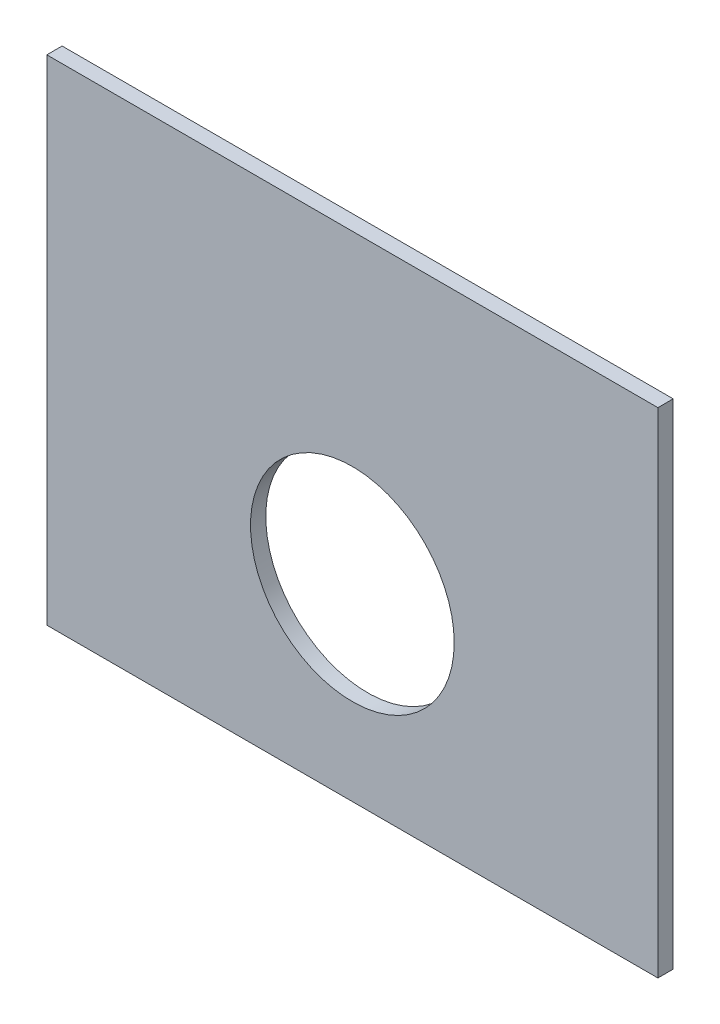
ISO-10303-21;
HEADER;
FILE_DESCRIPTION(('STEP AP214'),'2;1');
FILE_NAME('part.step','',(''),(''),'','','');
FILE_SCHEMA(('AUTOMOTIVE_DESIGN { 1 0 10303 214 1 1 1 1 }'));
ENDSEC;
DATA;
#1=APPLICATION_CONTEXT('core data for automotive mechanical design processes');
#2=APPLICATION_PROTOCOL_DEFINITION('international standard','automotive_design',2000,#1);
#3=PRODUCT_CONTEXT('',#1,'mechanical');
#4=PRODUCT('Part','Part','',(#3));
#5=PRODUCT_RELATED_PRODUCT_CATEGORY('part','',(#4));
#6=PRODUCT_DEFINITION_FORMATION('','',#4);
#7=PRODUCT_DEFINITION_CONTEXT('part definition',#1,'design');
#8=PRODUCT_DEFINITION('design','',#6,#7);
#9=PRODUCT_DEFINITION_SHAPE('','',#8);
#10=(LENGTH_UNIT() NAMED_UNIT(*) SI_UNIT(.MILLI.,.METRE.));
#11=(NAMED_UNIT(*) PLANE_ANGLE_UNIT() SI_UNIT($,.RADIAN.));
#12=(NAMED_UNIT(*) SI_UNIT($,.STERADIAN.) SOLID_ANGLE_UNIT());
#13=UNCERTAINTY_MEASURE_WITH_UNIT(LENGTH_MEASURE(1.E-05),#10,'distance_accuracy_value','');
#14=(GEOMETRIC_REPRESENTATION_CONTEXT(3) GLOBAL_UNCERTAINTY_ASSIGNED_CONTEXT((#13)) GLOBAL_UNIT_ASSIGNED_CONTEXT((#10,
#11,#12)) REPRESENTATION_CONTEXT('',''));
#15=CARTESIAN_POINT('',(0.,0.,0.));
#16=DIRECTION('',(0.,0.,1.));
#17=DIRECTION('',(1.,0.,0.));
#18=AXIS2_PLACEMENT_3D('',#15,#16,#17);
#19=CARTESIAN_POINT('',(-60.,-48.5,3.));
#20=DIRECTION('',(1.,0.,0.));
#21=DIRECTION('',(0.,0.,-1.));
#22=AXIS2_PLACEMENT_3D('',#19,#20,#21);
#23=PLANE('',#22);
#24=DIRECTION('',(0.,-1.,0.));
#25=VECTOR('',#24,1.);
#26=CARTESIAN_POINT('',(-60.,-48.5,0.));
#27=LINE('',#26,#25);
#28=CARTESIAN_POINT('',(-60.,48.5,0.));
#29=VERTEX_POINT('',#28);
#30=CARTESIAN_POINT('',(-60.,-48.5,0.));
#31=VERTEX_POINT('',#30);
#32=EDGE_CURVE('E102',#29,#31,#27,.T.);
#33=ORIENTED_EDGE('',*,*,#32,.T.);
#34=DIRECTION('',(0.,0.,-1.));
#35=VECTOR('',#34,1.);
#36=CARTESIAN_POINT('',(-60.,-48.5,3.));
#37=LINE('',#36,#35);
#38=CARTESIAN_POINT('',(-60.,-48.5,3.));
#39=VERTEX_POINT('',#38);
#40=EDGE_CURVE('E11',#39,#31,#37,.T.);
#41=ORIENTED_EDGE('',*,*,#40,.F.);
#42=DIRECTION('',(0.,-1.,0.));
#43=VECTOR('',#42,1.);
#44=CARTESIAN_POINT('',(-60.,-48.5,3.));
#45=LINE('',#44,#43);
#46=CARTESIAN_POINT('',(-60.,48.5,3.));
#47=VERTEX_POINT('',#46);
#48=EDGE_CURVE('E90',#47,#39,#45,.T.);
#49=ORIENTED_EDGE('',*,*,#48,.F.);
#50=DIRECTION('',(0.,0.,-1.));
#51=VECTOR('',#50,1.);
#52=CARTESIAN_POINT('',(-60.,48.5,3.));
#53=LINE('',#52,#51);
#54=EDGE_CURVE('E98',#47,#29,#53,.T.);
#55=ORIENTED_EDGE('',*,*,#54,.T.);
#56=EDGE_LOOP('',(#33,#41,#49,#55));
#57=FACE_BOUND('',#56,.T.);
#58=ADVANCED_FACE('F39',(#57),#23,.F.);
#59=CARTESIAN_POINT('',(60.,-48.5,3.));
#60=DIRECTION('',(0.,1.,0.));
#61=DIRECTION('',(-1.,0.,0.));
#62=AXIS2_PLACEMENT_3D('',#59,#60,#61);
#63=PLANE('',#62);
#64=DIRECTION('',(1.,0.,0.));
#65=VECTOR('',#64,1.);
#66=CARTESIAN_POINT('',(60.,-48.5,0.));
#67=LINE('',#66,#65);
#68=CARTESIAN_POINT('',(60.,-48.5,0.));
#69=VERTEX_POINT('',#68);
#70=EDGE_CURVE('E94',#31,#69,#67,.T.);
#71=ORIENTED_EDGE('',*,*,#70,.T.);
#72=DIRECTION('',(0.,0.,-1.));
#73=VECTOR('',#72,1.);
#74=CARTESIAN_POINT('',(60.,-48.5,3.));
#75=LINE('',#74,#73);
#76=CARTESIAN_POINT('',(60.,-48.5,3.));
#77=VERTEX_POINT('',#76);
#78=EDGE_CURVE('E47',#77,#69,#75,.T.);
#79=ORIENTED_EDGE('',*,*,#78,.F.);
#80=DIRECTION('',(1.,0.,0.));
#81=VECTOR('',#80,1.);
#82=CARTESIAN_POINT('',(60.,-48.5,3.));
#83=LINE('',#82,#81);
#84=EDGE_CURVE('E85',#39,#77,#83,.T.);
#85=ORIENTED_EDGE('',*,*,#84,.F.);
#86=ORIENTED_EDGE('',*,*,#40,.T.);
#87=EDGE_LOOP('',(#71,#79,#85,#86));
#88=FACE_BOUND('',#87,.T.);
#89=ADVANCED_FACE('F93',(#88),#63,.F.);
#90=CARTESIAN_POINT('',(60.,-48.5,3.));
#91=DIRECTION('',(-1.,0.,0.));
#92=DIRECTION('',(0.,0.,1.));
#93=AXIS2_PLACEMENT_3D('',#90,#91,#92);
#94=PLANE('',#93);
#95=DIRECTION('',(0.,1.,0.));
#96=VECTOR('',#95,1.);
#97=CARTESIAN_POINT('',(60.,-48.5,0.));
#98=LINE('',#97,#96);
#99=CARTESIAN_POINT('',(60.,48.5,0.));
#100=VERTEX_POINT('',#99);
#101=EDGE_CURVE('E72',#69,#100,#98,.T.);
#102=ORIENTED_EDGE('',*,*,#101,.T.);
#103=DIRECTION('',(0.,0.,-1.));
#104=VECTOR('',#103,1.);
#105=CARTESIAN_POINT('',(60.,48.5,3.));
#106=LINE('',#105,#104);
#107=CARTESIAN_POINT('',(60.,48.5,3.));
#108=VERTEX_POINT('',#107);
#109=EDGE_CURVE('E95',#108,#100,#106,.T.);
#110=ORIENTED_EDGE('',*,*,#109,.F.);
#111=DIRECTION('',(0.,1.,0.));
#112=VECTOR('',#111,1.);
#113=CARTESIAN_POINT('',(60.,-48.5,3.));
#114=LINE('',#113,#112);
#115=EDGE_CURVE('E88',#77,#108,#114,.T.);
#116=ORIENTED_EDGE('',*,*,#115,.F.);
#117=ORIENTED_EDGE('',*,*,#78,.T.);
#118=EDGE_LOOP('',(#102,#110,#116,#117));
#119=FACE_BOUND('',#118,.T.);
#120=ADVANCED_FACE('F96',(#119),#94,.F.);
#121=CARTESIAN_POINT('',(60.,48.5,3.));
#122=DIRECTION('',(0.,-1.,0.));
#123=DIRECTION('',(1.,0.,0.));
#124=AXIS2_PLACEMENT_3D('',#121,#122,#123);
#125=PLANE('',#124);
#126=DIRECTION('',(-1.,0.,0.));
#127=VECTOR('',#126,1.);
#128=CARTESIAN_POINT('',(60.,48.5,0.));
#129=LINE('',#128,#127);
#130=EDGE_CURVE('E78',#100,#29,#129,.T.);
#131=ORIENTED_EDGE('',*,*,#130,.T.);
#132=ORIENTED_EDGE('',*,*,#54,.F.);
#133=DIRECTION('',(-1.,0.,0.));
#134=VECTOR('',#133,1.);
#135=CARTESIAN_POINT('',(60.,48.5,3.));
#136=LINE('',#135,#134);
#137=EDGE_CURVE('E55',#108,#47,#136,.T.);
#138=ORIENTED_EDGE('',*,*,#137,.F.);
#139=ORIENTED_EDGE('',*,*,#109,.T.);
#140=EDGE_LOOP('',(#131,#132,#138,#139));
#141=FACE_BOUND('',#140,.T.);
#142=ADVANCED_FACE('F110',(#141),#125,.F.);
#143=CARTESIAN_POINT('',(0.,0.,3.));
#144=DIRECTION('',(0.,0.,1.));
#145=DIRECTION('',(1.,0.,0.));
#146=AXIS2_PLACEMENT_3D('',#143,#144,#145);
#147=PLANE('',#146);
#148=CARTESIAN_POINT('',(0.,-11.5,3.));
#149=DIRECTION('',(0.,0.,1.));
#150=DIRECTION('',(1.,0.,0.));
#151=AXIS2_PLACEMENT_3D('',#148,#149,#150);
#152=CIRCLE('',#151,20.);
#153=CARTESIAN_POINT('',(20.,-11.5,3.));
#154=VERTEX_POINT('',#153);
#155=EDGE_CURVE('E116',#154,#154,#152,.T.);
#156=ORIENTED_EDGE('',*,*,#155,.F.);
#157=EDGE_LOOP('',(#156));
#158=FACE_BOUND('',#157,.T.);
#159=ORIENTED_EDGE('',*,*,#48,.T.);
#160=ORIENTED_EDGE('',*,*,#84,.T.);
#161=ORIENTED_EDGE('',*,*,#115,.T.);
#162=ORIENTED_EDGE('',*,*,#137,.T.);
#163=EDGE_LOOP('',(#159,#160,#161,#162));
#164=FACE_BOUND('',#163,.T.);
#165=ADVANCED_FACE('F86',(#158,#164),#147,.T.);
#166=CARTESIAN_POINT('',(0.,0.,0.));
#167=DIRECTION('',(0.,0.,1.));
#168=DIRECTION('',(1.,0.,0.));
#169=AXIS2_PLACEMENT_3D('',#166,#167,#168);
#170=PLANE('',#169);
#171=CARTESIAN_POINT('',(0.,-11.5,0.));
#172=DIRECTION('',(0.,0.,1.));
#173=DIRECTION('',(1.,0.,0.));
#174=AXIS2_PLACEMENT_3D('',#171,#172,#173);
#175=CIRCLE('',#174,20.);
#176=CARTESIAN_POINT('',(20.,-11.5,0.));
#177=VERTEX_POINT('',#176);
#178=EDGE_CURVE('E105',#177,#177,#175,.T.);
#179=ORIENTED_EDGE('',*,*,#178,.T.);
#180=EDGE_LOOP('',(#179));
#181=FACE_BOUND('',#180,.T.);
#182=ORIENTED_EDGE('',*,*,#32,.F.);
#183=ORIENTED_EDGE('',*,*,#130,.F.);
#184=ORIENTED_EDGE('',*,*,#101,.F.);
#185=ORIENTED_EDGE('',*,*,#70,.F.);
#186=EDGE_LOOP('',(#182,#183,#184,#185));
#187=FACE_BOUND('',#186,.T.);
#188=ADVANCED_FACE('F113',(#181,#187),#170,.F.);
#189=CARTESIAN_POINT('',(0.,-11.5,0.));
#190=DIRECTION('',(0.,0.,1.));
#191=DIRECTION('',(1.,0.,0.));
#192=AXIS2_PLACEMENT_3D('',#189,#190,#191);
#193=CYLINDRICAL_SURFACE('',#192,20.);
#194=ORIENTED_EDGE('',*,*,#178,.F.);
#195=EDGE_LOOP('',(#194));
#196=FACE_BOUND('',#195,.T.);
#197=ORIENTED_EDGE('',*,*,#155,.T.);
#198=EDGE_LOOP('',(#197));
#199=FACE_BOUND('',#198,.T.);
#200=ADVANCED_FACE('F123',(#196,#199),#193,.F.);
#201=CLOSED_SHELL('',(#58,#89,#120,#142,#165,#188,#200));
#202=MANIFOLD_SOLID_BREP('B2',#201);
#203=ADVANCED_BREP_SHAPE_REPRESENTATION('',(#18,#202),#14);
#204=SHAPE_DEFINITION_REPRESENTATION(#9,#203);
ENDSEC;
END-ISO-10303-21;
